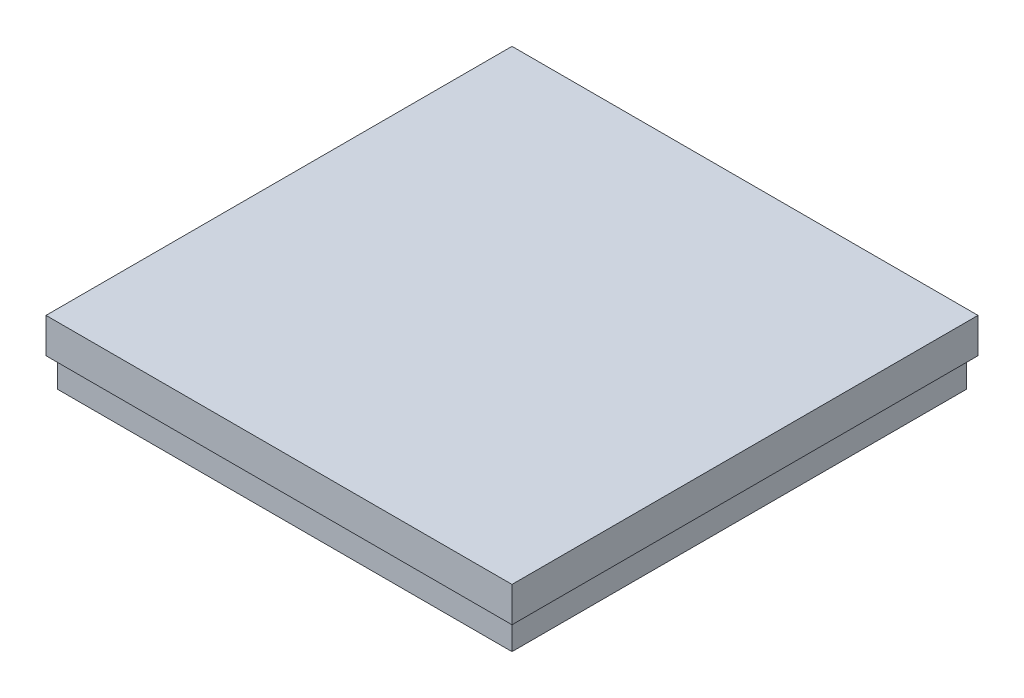
ISO-10303-21;
HEADER;
FILE_DESCRIPTION(('STEP AP214'),'2;1');
FILE_NAME('part.step','',(''),(''),'','','');
FILE_SCHEMA(('AUTOMOTIVE_DESIGN { 1 0 10303 214 1 1 1 1 }'));
ENDSEC;
DATA;
#1=APPLICATION_CONTEXT('core data for automotive mechanical design processes');
#2=APPLICATION_PROTOCOL_DEFINITION('international standard','automotive_design',2000,#1);
#3=PRODUCT_CONTEXT('',#1,'mechanical');
#4=PRODUCT('Part','Part','',(#3));
#5=PRODUCT_RELATED_PRODUCT_CATEGORY('part','',(#4));
#6=PRODUCT_DEFINITION_FORMATION('','',#4);
#7=PRODUCT_DEFINITION_CONTEXT('part definition',#1,'design');
#8=PRODUCT_DEFINITION('design','',#6,#7);
#9=PRODUCT_DEFINITION_SHAPE('','',#8);
#10=(LENGTH_UNIT() NAMED_UNIT(*) SI_UNIT(.MILLI.,.METRE.));
#11=(NAMED_UNIT(*) PLANE_ANGLE_UNIT() SI_UNIT($,.RADIAN.));
#12=(NAMED_UNIT(*) SI_UNIT($,.STERADIAN.) SOLID_ANGLE_UNIT());
#13=UNCERTAINTY_MEASURE_WITH_UNIT(LENGTH_MEASURE(1.E-05),#10,'distance_accuracy_value','');
#14=(GEOMETRIC_REPRESENTATION_CONTEXT(3) GLOBAL_UNCERTAINTY_ASSIGNED_CONTEXT((#13)) GLOBAL_UNIT_ASSIGNED_CONTEXT((#10,
#11,#12)) REPRESENTATION_CONTEXT('',''));
#15=CARTESIAN_POINT('',(0.,0.,0.));
#16=DIRECTION('',(0.,0.,1.));
#17=DIRECTION('',(1.,0.,0.));
#18=AXIS2_PLACEMENT_3D('',#15,#16,#17);
#19=CARTESIAN_POINT('',(-16.7790697674419,5.5,-6.65116279069767));
#20=DIRECTION('',(0.,0.,1.));
#21=DIRECTION('',(1.,0.,0.));
#22=AXIS2_PLACEMENT_3D('',#19,#20,#21);
#23=PLANE('',#22);
#24=DIRECTION('',(-1.,0.,0.));
#25=VECTOR('',#24,1.);
#26=CARTESIAN_POINT('',(22.7209302325581,2.5,-6.65116279069767));
#27=LINE('',#26,#25);
#28=CARTESIAN_POINT('',(22.2209302325581,2.5,-6.65116279069767));
#29=VERTEX_POINT('',#28);
#30=CARTESIAN_POINT('',(-16.7790697674419,2.5,-6.65116279069767));
#31=VERTEX_POINT('',#30);
#32=EDGE_CURVE('E11',#29,#31,#27,.T.);
#33=ORIENTED_EDGE('',*,*,#32,.F.);
#34=DIRECTION('',(0.,-1.,0.));
#35=VECTOR('',#34,1.);
#36=CARTESIAN_POINT('',(22.2209302325581,5.5,-6.65116279069767));
#37=LINE('',#36,#35);
#38=CARTESIAN_POINT('',(22.2209302325581,0.,-6.65116279069767));
#39=VERTEX_POINT('',#38);
#40=EDGE_CURVE('E215',#29,#39,#37,.T.);
#41=ORIENTED_EDGE('',*,*,#40,.T.);
#42=DIRECTION('',(-1.,0.,0.));
#43=VECTOR('',#42,1.);
#44=CARTESIAN_POINT('',(-16.7790697674419,0.,-6.65116279069767));
#45=LINE('',#44,#43);
#46=CARTESIAN_POINT('',(-16.7790697674419,0.,-6.65116279069767));
#47=VERTEX_POINT('',#46);
#48=EDGE_CURVE('E210',#39,#47,#45,.T.);
#49=ORIENTED_EDGE('',*,*,#48,.T.);
#50=DIRECTION('',(0.,-1.,0.));
#51=VECTOR('',#50,1.);
#52=CARTESIAN_POINT('',(-16.7790697674419,5.5,-6.65116279069767));
#53=LINE('',#52,#51);
#54=EDGE_CURVE('E213',#31,#47,#53,.T.);
#55=ORIENTED_EDGE('',*,*,#54,.F.);
#56=EDGE_LOOP('',(#33,#41,#49,#55));
#57=FACE_BOUND('',#56,.T.);
#58=ADVANCED_FACE('F35',(#57),#23,.F.);
#59=CARTESIAN_POINT('',(22.2209302325581,5.5,-6.65116279069767));
#60=DIRECTION('',(-1.,0.,0.));
#61=DIRECTION('',(0.,0.,1.));
#62=AXIS2_PLACEMENT_3D('',#59,#60,#61);
#63=PLANE('',#62);
#64=DIRECTION('',(0.,0.,-1.));
#65=VECTOR('',#64,1.);
#66=CARTESIAN_POINT('',(22.2209302325581,2.5,32.8488372093023));
#67=LINE('',#66,#65);
#68=CARTESIAN_POINT('',(22.2209302325581,2.5,32.3488372093023));
#69=VERTEX_POINT('',#68);
#70=EDGE_CURVE('E44',#69,#29,#67,.T.);
#71=ORIENTED_EDGE('',*,*,#70,.F.);
#72=DIRECTION('',(0.,-1.,0.));
#73=VECTOR('',#72,1.);
#74=CARTESIAN_POINT('',(22.2209302325581,5.5,32.3488372093023));
#75=LINE('',#74,#73);
#76=CARTESIAN_POINT('',(22.2209302325581,0.,32.3488372093023));
#77=VERTEX_POINT('',#76);
#78=EDGE_CURVE('E216',#69,#77,#75,.T.);
#79=ORIENTED_EDGE('',*,*,#78,.T.);
#80=DIRECTION('',(0.,0.,-1.));
#81=VECTOR('',#80,1.);
#82=CARTESIAN_POINT('',(22.2209302325581,0.,-6.65116279069767));
#83=LINE('',#82,#81);
#84=EDGE_CURVE('E207',#77,#39,#83,.T.);
#85=ORIENTED_EDGE('',*,*,#84,.T.);
#86=ORIENTED_EDGE('',*,*,#40,.F.);
#87=EDGE_LOOP('',(#71,#79,#85,#86));
#88=FACE_BOUND('',#87,.T.);
#89=ADVANCED_FACE('F232',(#88),#63,.F.);
#90=CARTESIAN_POINT('',(-16.7790697674419,5.5,32.3488372093023));
#91=DIRECTION('',(0.,0.,-1.));
#92=DIRECTION('',(-1.,0.,0.));
#93=AXIS2_PLACEMENT_3D('',#90,#91,#92);
#94=PLANE('',#93);
#95=DIRECTION('',(1.,0.,0.));
#96=VECTOR('',#95,1.);
#97=CARTESIAN_POINT('',(-17.2790697674419,2.5,32.3488372093023));
#98=LINE('',#97,#96);
#99=CARTESIAN_POINT('',(-16.7790697674419,2.5,32.3488372093023));
#100=VERTEX_POINT('',#99);
#101=EDGE_CURVE('E185',#100,#69,#98,.T.);
#102=ORIENTED_EDGE('',*,*,#101,.F.);
#103=DIRECTION('',(0.,-1.,0.));
#104=VECTOR('',#103,1.);
#105=CARTESIAN_POINT('',(-16.7790697674419,5.5,32.3488372093023));
#106=LINE('',#105,#104);
#107=CARTESIAN_POINT('',(-16.7790697674419,0.,32.3488372093023));
#108=VERTEX_POINT('',#107);
#109=EDGE_CURVE('E39',#100,#108,#106,.T.);
#110=ORIENTED_EDGE('',*,*,#109,.T.);
#111=DIRECTION('',(1.,0.,0.));
#112=VECTOR('',#111,1.);
#113=CARTESIAN_POINT('',(-16.7790697674419,0.,32.3488372093023));
#114=LINE('',#113,#112);
#115=EDGE_CURVE('E204',#108,#77,#114,.T.);
#116=ORIENTED_EDGE('',*,*,#115,.T.);
#117=ORIENTED_EDGE('',*,*,#78,.F.);
#118=EDGE_LOOP('',(#102,#110,#116,#117));
#119=FACE_BOUND('',#118,.T.);
#120=ADVANCED_FACE('F222',(#119),#94,.F.);
#121=CARTESIAN_POINT('',(-16.7790697674419,5.5,-6.65116279069767));
#122=DIRECTION('',(1.,0.,0.));
#123=DIRECTION('',(0.,0.,-1.));
#124=AXIS2_PLACEMENT_3D('',#121,#122,#123);
#125=PLANE('',#124);
#126=DIRECTION('',(0.,0.,1.));
#127=VECTOR('',#126,1.);
#128=CARTESIAN_POINT('',(-16.7790697674419,2.5,-6.65116279069767));
#129=LINE('',#128,#127);
#130=EDGE_CURVE('E193',#31,#100,#129,.T.);
#131=ORIENTED_EDGE('',*,*,#130,.F.);
#132=ORIENTED_EDGE('',*,*,#54,.T.);
#133=DIRECTION('',(0.,0.,1.));
#134=VECTOR('',#133,1.);
#135=CARTESIAN_POINT('',(-16.7790697674419,0.,-6.65116279069767));
#136=LINE('',#135,#134);
#137=EDGE_CURVE('E200',#47,#108,#136,.T.);
#138=ORIENTED_EDGE('',*,*,#137,.T.);
#139=ORIENTED_EDGE('',*,*,#109,.F.);
#140=EDGE_LOOP('',(#131,#132,#138,#139));
#141=FACE_BOUND('',#140,.T.);
#142=ADVANCED_FACE('F37',(#141),#125,.F.);
#143=CARTESIAN_POINT('',(0.,5.5,0.));
#144=DIRECTION('',(0.,1.,0.));
#145=DIRECTION('',(0.,0.,1.));
#146=AXIS2_PLACEMENT_3D('',#143,#144,#145);
#147=PLANE('',#146);
#148=DIRECTION('',(0.,0.,1.));
#149=VECTOR('',#148,1.);
#150=CARTESIAN_POINT('',(22.7209302325581,5.5,32.8488372093023));
#151=LINE('',#150,#149);
#152=CARTESIAN_POINT('',(22.7209302325581,5.5,-7.15116279069767));
#153=VERTEX_POINT('',#152);
#154=CARTESIAN_POINT('',(22.7209302325581,5.5,32.8488372093023));
#155=VERTEX_POINT('',#154);
#156=EDGE_CURVE('E180',#153,#155,#151,.T.);
#157=ORIENTED_EDGE('',*,*,#156,.F.);
#158=DIRECTION('',(1.,0.,0.));
#159=VECTOR('',#158,1.);
#160=CARTESIAN_POINT('',(22.7209302325581,5.5,-7.15116279069767));
#161=LINE('',#160,#159);
#162=CARTESIAN_POINT('',(-17.2790697674419,5.5,-7.15116279069767));
#163=VERTEX_POINT('',#162);
#164=EDGE_CURVE('E172',#163,#153,#161,.T.);
#165=ORIENTED_EDGE('',*,*,#164,.F.);
#166=DIRECTION('',(0.,0.,-1.));
#167=VECTOR('',#166,1.);
#168=CARTESIAN_POINT('',(-17.2790697674419,5.5,-6.65116279069767));
#169=LINE('',#168,#167);
#170=CARTESIAN_POINT('',(-17.2790697674419,5.5,32.8488372093023));
#171=VERTEX_POINT('',#170);
#172=EDGE_CURVE('E198',#171,#163,#169,.T.);
#173=ORIENTED_EDGE('',*,*,#172,.F.);
#174=DIRECTION('',(-1.,0.,0.));
#175=VECTOR('',#174,1.);
#176=CARTESIAN_POINT('',(-17.2790697674419,5.5,32.8488372093023));
#177=LINE('',#176,#175);
#178=EDGE_CURVE('E190',#155,#171,#177,.T.);
#179=ORIENTED_EDGE('',*,*,#178,.F.);
#180=EDGE_LOOP('',(#157,#165,#173,#179));
#181=FACE_BOUND('',#180,.T.);
#182=ADVANCED_FACE('F244',(#181),#147,.T.);
#183=CARTESIAN_POINT('',(0.,0.,0.));
#184=DIRECTION('',(0.,1.,0.));
#185=DIRECTION('',(0.,0.,1.));
#186=AXIS2_PLACEMENT_3D('',#183,#184,#185);
#187=PLANE('',#186);
#188=DIRECTION('',(1.,0.,0.));
#189=VECTOR('',#188,1.);
#190=CARTESIAN_POINT('',(-16.2790697674419,0.,-6.15116279069767));
#191=LINE('',#190,#189);
#192=CARTESIAN_POINT('',(-16.2790697674419,0.,-6.15116279069767));
#193=VERTEX_POINT('',#192);
#194=CARTESIAN_POINT('',(21.7209302325581,0.,-6.15116279069767));
#195=VERTEX_POINT('',#194);
#196=EDGE_CURVE('E154',#193,#195,#191,.T.);
#197=ORIENTED_EDGE('',*,*,#196,.F.);
#198=DIRECTION('',(0.,0.,-1.));
#199=VECTOR('',#198,1.);
#200=CARTESIAN_POINT('',(-16.2790697674419,0.,31.8488372093023));
#201=LINE('',#200,#199);
#202=CARTESIAN_POINT('',(-16.2790697674419,0.,31.8488372093023));
#203=VERTEX_POINT('',#202);
#204=EDGE_CURVE('E52',#203,#193,#201,.T.);
#205=ORIENTED_EDGE('',*,*,#204,.F.);
#206=DIRECTION('',(-1.,0.,0.));
#207=VECTOR('',#206,1.);
#208=CARTESIAN_POINT('',(-16.2790697674419,0.,31.8488372093023));
#209=LINE('',#208,#207);
#210=CARTESIAN_POINT('',(21.7209302325581,0.,31.8488372093023));
#211=VERTEX_POINT('',#210);
#212=EDGE_CURVE('E145',#211,#203,#209,.T.);
#213=ORIENTED_EDGE('',*,*,#212,.F.);
#214=DIRECTION('',(0.,0.,1.));
#215=VECTOR('',#214,1.);
#216=CARTESIAN_POINT('',(21.7209302325581,0.,31.8488372093023));
#217=LINE('',#216,#215);
#218=EDGE_CURVE('E148',#195,#211,#217,.T.);
#219=ORIENTED_EDGE('',*,*,#218,.F.);
#220=EDGE_LOOP('',(#197,#205,#213,#219));
#221=FACE_BOUND('',#220,.T.);
#222=ORIENTED_EDGE('',*,*,#137,.F.);
#223=ORIENTED_EDGE('',*,*,#48,.F.);
#224=ORIENTED_EDGE('',*,*,#84,.F.);
#225=ORIENTED_EDGE('',*,*,#115,.F.);
#226=EDGE_LOOP('',(#222,#223,#224,#225));
#227=FACE_BOUND('',#226,.T.);
#228=ADVANCED_FACE('F227',(#221,#227),#187,.F.);
#229=CARTESIAN_POINT('',(-17.2790697674419,2.5,-6.65116279069767));
#230=DIRECTION('',(0.,1.,0.));
#231=DIRECTION('',(0.,0.,1.));
#232=AXIS2_PLACEMENT_3D('',#229,#230,#231);
#233=PLANE('',#232);
#234=ORIENTED_EDGE('',*,*,#70,.T.);
#235=ORIENTED_EDGE('',*,*,#32,.T.);
#236=ORIENTED_EDGE('',*,*,#130,.T.);
#237=ORIENTED_EDGE('',*,*,#101,.T.);
#238=EDGE_LOOP('',(#234,#235,#236,#237));
#239=FACE_BOUND('',#238,.T.);
#240=DIRECTION('',(-1.,0.,0.));
#241=VECTOR('',#240,1.);
#242=CARTESIAN_POINT('',(22.7209302325581,2.5,-7.15116279069767));
#243=LINE('',#242,#241);
#244=CARTESIAN_POINT('',(22.7209302325581,2.5,-7.15116279069767));
#245=VERTEX_POINT('',#244);
#246=CARTESIAN_POINT('',(-17.2790697674419,2.5,-7.15116279069767));
#247=VERTEX_POINT('',#246);
#248=EDGE_CURVE('E166',#245,#247,#243,.T.);
#249=ORIENTED_EDGE('',*,*,#248,.F.);
#250=DIRECTION('',(0.,0.,-1.));
#251=VECTOR('',#250,1.);
#252=CARTESIAN_POINT('',(22.7209302325581,2.5,32.8488372093023));
#253=LINE('',#252,#251);
#254=CARTESIAN_POINT('',(22.7209302325581,2.5,32.8488372093023));
#255=VERTEX_POINT('',#254);
#256=EDGE_CURVE('E178',#255,#245,#253,.T.);
#257=ORIENTED_EDGE('',*,*,#256,.F.);
#258=DIRECTION('',(1.,0.,0.));
#259=VECTOR('',#258,1.);
#260=CARTESIAN_POINT('',(-17.2790697674419,2.5,32.8488372093023));
#261=LINE('',#260,#259);
#262=CARTESIAN_POINT('',(-17.2790697674419,2.5,32.8488372093023));
#263=VERTEX_POINT('',#262);
#264=EDGE_CURVE('E188',#263,#255,#261,.T.);
#265=ORIENTED_EDGE('',*,*,#264,.F.);
#266=DIRECTION('',(0.,0.,1.));
#267=VECTOR('',#266,1.);
#268=CARTESIAN_POINT('',(-17.2790697674419,2.5,-6.65116279069767));
#269=LINE('',#268,#267);
#270=EDGE_CURVE('E196',#247,#263,#269,.T.);
#271=ORIENTED_EDGE('',*,*,#270,.F.);
#272=EDGE_LOOP('',(#249,#257,#265,#271));
#273=FACE_BOUND('',#272,.T.);
#274=ADVANCED_FACE('F243',(#239,#273),#233,.F.);
#275=CARTESIAN_POINT('',(-17.2790697674419,0.,0.));
#276=DIRECTION('',(-1.,0.,0.));
#277=DIRECTION('',(0.,0.,1.));
#278=AXIS2_PLACEMENT_3D('',#275,#276,#277);
#279=PLANE('',#278);
#280=ORIENTED_EDGE('',*,*,#172,.T.);
#281=DIRECTION('',(0.,1.,0.));
#282=VECTOR('',#281,1.);
#283=CARTESIAN_POINT('',(-17.2790697674419,5.5,-7.15116279069767));
#284=LINE('',#283,#282);
#285=EDGE_CURVE('E169',#247,#163,#284,.T.);
#286=ORIENTED_EDGE('',*,*,#285,.F.);
#287=ORIENTED_EDGE('',*,*,#270,.T.);
#288=DIRECTION('',(0.,-1.,0.));
#289=VECTOR('',#288,1.);
#290=CARTESIAN_POINT('',(-17.2790697674419,5.5,32.8488372093023));
#291=LINE('',#290,#289);
#292=EDGE_CURVE('E183',#171,#263,#291,.T.);
#293=ORIENTED_EDGE('',*,*,#292,.F.);
#294=EDGE_LOOP('',(#280,#286,#287,#293));
#295=FACE_BOUND('',#294,.T.);
#296=ADVANCED_FACE('F251',(#295),#279,.T.);
#297=CARTESIAN_POINT('',(0.,0.,32.8488372093023));
#298=DIRECTION('',(0.,0.,1.));
#299=DIRECTION('',(1.,0.,0.));
#300=AXIS2_PLACEMENT_3D('',#297,#298,#299);
#301=PLANE('',#300);
#302=ORIENTED_EDGE('',*,*,#292,.T.);
#303=ORIENTED_EDGE('',*,*,#264,.T.);
#304=DIRECTION('',(0.,-1.,0.));
#305=VECTOR('',#304,1.);
#306=CARTESIAN_POINT('',(22.7209302325581,5.5,32.8488372093023));
#307=LINE('',#306,#305);
#308=EDGE_CURVE('E174',#155,#255,#307,.T.);
#309=ORIENTED_EDGE('',*,*,#308,.F.);
#310=ORIENTED_EDGE('',*,*,#178,.T.);
#311=EDGE_LOOP('',(#302,#303,#309,#310));
#312=FACE_BOUND('',#311,.T.);
#313=ADVANCED_FACE('F254',(#312),#301,.T.);
#314=CARTESIAN_POINT('',(22.7209302325581,0.,0.));
#315=DIRECTION('',(1.,0.,0.));
#316=DIRECTION('',(0.,0.,-1.));
#317=AXIS2_PLACEMENT_3D('',#314,#315,#316);
#318=PLANE('',#317);
#319=ORIENTED_EDGE('',*,*,#308,.T.);
#320=ORIENTED_EDGE('',*,*,#256,.T.);
#321=DIRECTION('',(0.,-1.,0.));
#322=VECTOR('',#321,1.);
#323=CARTESIAN_POINT('',(22.7209302325581,5.5,-7.15116279069767));
#324=LINE('',#323,#322);
#325=EDGE_CURVE('E160',#153,#245,#324,.T.);
#326=ORIENTED_EDGE('',*,*,#325,.F.);
#327=ORIENTED_EDGE('',*,*,#156,.T.);
#328=EDGE_LOOP('',(#319,#320,#326,#327));
#329=FACE_BOUND('',#328,.T.);
#330=ADVANCED_FACE('F258',(#329),#318,.T.);
#331=CARTESIAN_POINT('',(0.,0.,-7.15116279069767));
#332=DIRECTION('',(0.,0.,-1.));
#333=DIRECTION('',(-1.,0.,0.));
#334=AXIS2_PLACEMENT_3D('',#331,#332,#333);
#335=PLANE('',#334);
#336=ORIENTED_EDGE('',*,*,#325,.T.);
#337=ORIENTED_EDGE('',*,*,#248,.T.);
#338=ORIENTED_EDGE('',*,*,#285,.T.);
#339=ORIENTED_EDGE('',*,*,#164,.T.);
#340=EDGE_LOOP('',(#336,#337,#338,#339));
#341=FACE_BOUND('',#340,.T.);
#342=ADVANCED_FACE('F262',(#341),#335,.T.);
#343=CARTESIAN_POINT('',(-16.2790697674419,4.5,31.8488372093023));
#344=DIRECTION('',(-1.,0.,0.));
#345=DIRECTION('',(0.,0.,1.));
#346=AXIS2_PLACEMENT_3D('',#343,#344,#345);
#347=PLANE('',#346);
#348=ORIENTED_EDGE('',*,*,#204,.T.);
#349=DIRECTION('',(0.,-1.,0.));
#350=VECTOR('',#349,1.);
#351=CARTESIAN_POINT('',(-16.2790697674419,4.5,-6.15116279069767));
#352=LINE('',#351,#350);
#353=CARTESIAN_POINT('',(-16.2790697674419,4.5,-6.15116279069767));
#354=VERTEX_POINT('',#353);
#355=EDGE_CURVE('E123',#354,#193,#352,.T.);
#356=ORIENTED_EDGE('',*,*,#355,.F.);
#357=DIRECTION('',(0.,0.,-1.));
#358=VECTOR('',#357,1.);
#359=CARTESIAN_POINT('',(-16.2790697674419,4.5,31.8488372093023));
#360=LINE('',#359,#358);
#361=CARTESIAN_POINT('',(-16.2790697674419,4.5,31.8488372093023));
#362=VERTEX_POINT('',#361);
#363=EDGE_CURVE('E127',#362,#354,#360,.T.);
#364=ORIENTED_EDGE('',*,*,#363,.F.);
#365=DIRECTION('',(0.,-1.,0.));
#366=VECTOR('',#365,1.);
#367=CARTESIAN_POINT('',(-16.2790697674419,4.5,31.8488372093023));
#368=LINE('',#367,#366);
#369=EDGE_CURVE('E158',#362,#203,#368,.T.);
#370=ORIENTED_EDGE('',*,*,#369,.T.);
#371=EDGE_LOOP('',(#348,#356,#364,#370));
#372=FACE_BOUND('',#371,.T.);
#373=ADVANCED_FACE('F125',(#372),#347,.F.);
#374=CARTESIAN_POINT('',(-16.2790697674419,4.5,31.8488372093023));
#375=DIRECTION('',(0.,0.,1.));
#376=DIRECTION('',(1.,0.,0.));
#377=AXIS2_PLACEMENT_3D('',#374,#375,#376);
#378=PLANE('',#377);
#379=ORIENTED_EDGE('',*,*,#212,.T.);
#380=ORIENTED_EDGE('',*,*,#369,.F.);
#381=DIRECTION('',(-1.,0.,0.));
#382=VECTOR('',#381,1.);
#383=CARTESIAN_POINT('',(-16.2790697674419,4.5,31.8488372093023));
#384=LINE('',#383,#382);
#385=CARTESIAN_POINT('',(21.7209302325581,4.5,31.8488372093023));
#386=VERTEX_POINT('',#385);
#387=EDGE_CURVE('E133',#386,#362,#384,.T.);
#388=ORIENTED_EDGE('',*,*,#387,.F.);
#389=DIRECTION('',(0.,-1.,0.));
#390=VECTOR('',#389,1.);
#391=CARTESIAN_POINT('',(21.7209302325581,4.5,31.8488372093023));
#392=LINE('',#391,#390);
#393=EDGE_CURVE('E161',#386,#211,#392,.T.);
#394=ORIENTED_EDGE('',*,*,#393,.T.);
#395=EDGE_LOOP('',(#379,#380,#388,#394));
#396=FACE_BOUND('',#395,.T.);
#397=ADVANCED_FACE('F269',(#396),#378,.F.);
#398=CARTESIAN_POINT('',(21.7209302325581,4.5,31.8488372093023));
#399=DIRECTION('',(1.,0.,0.));
#400=DIRECTION('',(0.,0.,-1.));
#401=AXIS2_PLACEMENT_3D('',#398,#399,#400);
#402=PLANE('',#401);
#403=ORIENTED_EDGE('',*,*,#218,.T.);
#404=ORIENTED_EDGE('',*,*,#393,.F.);
#405=DIRECTION('',(0.,0.,1.));
#406=VECTOR('',#405,1.);
#407=CARTESIAN_POINT('',(21.7209302325581,4.5,31.8488372093023));
#408=LINE('',#407,#406);
#409=CARTESIAN_POINT('',(21.7209302325581,4.5,-6.15116279069767));
#410=VERTEX_POINT('',#409);
#411=EDGE_CURVE('E141',#410,#386,#408,.T.);
#412=ORIENTED_EDGE('',*,*,#411,.F.);
#413=DIRECTION('',(0.,-1.,0.));
#414=VECTOR('',#413,1.);
#415=CARTESIAN_POINT('',(21.7209302325581,4.5,-6.15116279069767));
#416=LINE('',#415,#414);
#417=EDGE_CURVE('E132',#410,#195,#416,.T.);
#418=ORIENTED_EDGE('',*,*,#417,.T.);
#419=EDGE_LOOP('',(#403,#404,#412,#418));
#420=FACE_BOUND('',#419,.T.);
#421=ADVANCED_FACE('F272',(#420),#402,.F.);
#422=CARTESIAN_POINT('',(-16.2790697674419,4.5,-6.15116279069767));
#423=DIRECTION('',(0.,0.,-1.));
#424=DIRECTION('',(-1.,0.,0.));
#425=AXIS2_PLACEMENT_3D('',#422,#423,#424);
#426=PLANE('',#425);
#427=ORIENTED_EDGE('',*,*,#196,.T.);
#428=ORIENTED_EDGE('',*,*,#417,.F.);
#429=DIRECTION('',(1.,0.,0.));
#430=VECTOR('',#429,1.);
#431=CARTESIAN_POINT('',(-16.2790697674419,4.5,-6.15116279069767));
#432=LINE('',#431,#430);
#433=EDGE_CURVE('E136',#354,#410,#432,.T.);
#434=ORIENTED_EDGE('',*,*,#433,.F.);
#435=ORIENTED_EDGE('',*,*,#355,.T.);
#436=EDGE_LOOP('',(#427,#428,#434,#435));
#437=FACE_BOUND('',#436,.T.);
#438=ADVANCED_FACE('F137',(#437),#426,.F.);
#439=CARTESIAN_POINT('',(0.,4.5,0.));
#440=DIRECTION('',(0.,-1.,0.));
#441=DIRECTION('',(0.,0.,-1.));
#442=AXIS2_PLACEMENT_3D('',#439,#440,#441);
#443=PLANE('',#442);
#444=ORIENTED_EDGE('',*,*,#363,.T.);
#445=ORIENTED_EDGE('',*,*,#433,.T.);
#446=ORIENTED_EDGE('',*,*,#411,.T.);
#447=ORIENTED_EDGE('',*,*,#387,.T.);
#448=EDGE_LOOP('',(#444,#445,#446,#447));
#449=FACE_BOUND('',#448,.T.);
#450=ADVANCED_FACE('F143',(#449),#443,.T.);
#451=CLOSED_SHELL('',(#58,#89,#120,#142,#182,#228,#274,#296,#313,#330,#342,#373,#397,#421,#438,#450));
#452=MANIFOLD_SOLID_BREP('B2',#451);
#453=ADVANCED_BREP_SHAPE_REPRESENTATION('',(#18,#452),#14);
#454=SHAPE_DEFINITION_REPRESENTATION(#9,#453);
ENDSEC;
END-ISO-10303-21;
